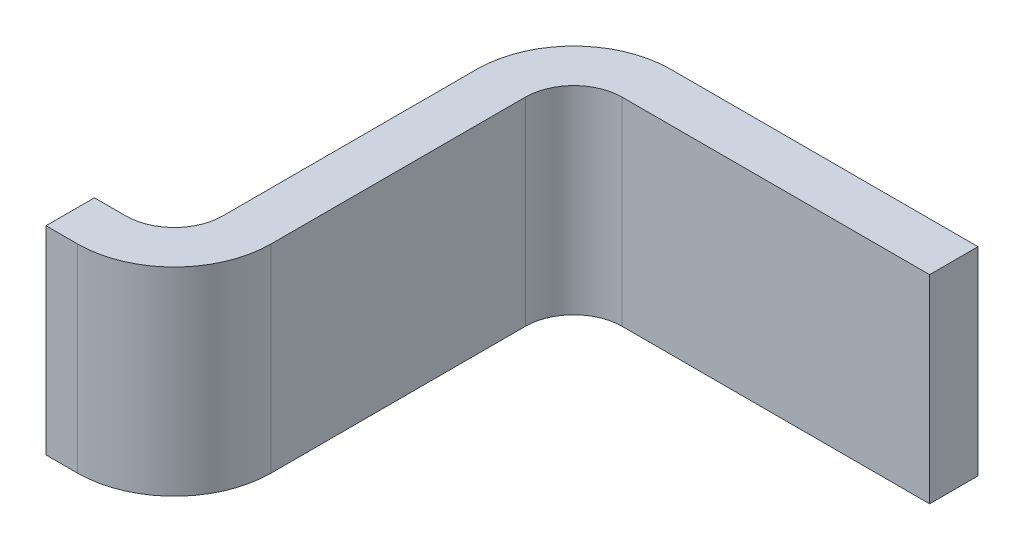
ISO-10303-21;
HEADER;
FILE_DESCRIPTION(('STEP AP214'),'2;1');
FILE_NAME('part.step','',(''),(''),'','','');
FILE_SCHEMA(('AUTOMOTIVE_DESIGN { 1 0 10303 214 1 1 1 1 }'));
ENDSEC;
DATA;
#1=APPLICATION_CONTEXT('core data for automotive mechanical design processes');
#2=APPLICATION_PROTOCOL_DEFINITION('international standard','automotive_design',2000,#1);
#3=PRODUCT_CONTEXT('',#1,'mechanical');
#4=PRODUCT('Part','Part','',(#3));
#5=PRODUCT_RELATED_PRODUCT_CATEGORY('part','',(#4));
#6=PRODUCT_DEFINITION_FORMATION('','',#4);
#7=PRODUCT_DEFINITION_CONTEXT('part definition',#1,'design');
#8=PRODUCT_DEFINITION('design','',#6,#7);
#9=PRODUCT_DEFINITION_SHAPE('','',#8);
#10=(LENGTH_UNIT() NAMED_UNIT(*) SI_UNIT(.MILLI.,.METRE.));
#11=(NAMED_UNIT(*) PLANE_ANGLE_UNIT() SI_UNIT($,.RADIAN.));
#12=(NAMED_UNIT(*) SI_UNIT($,.STERADIAN.) SOLID_ANGLE_UNIT());
#13=UNCERTAINTY_MEASURE_WITH_UNIT(LENGTH_MEASURE(1.E-05),#10,'distance_accuracy_value','');
#14=(GEOMETRIC_REPRESENTATION_CONTEXT(3) GLOBAL_UNCERTAINTY_ASSIGNED_CONTEXT((#13)) GLOBAL_UNIT_ASSIGNED_CONTEXT((#10,
#11,#12)) REPRESENTATION_CONTEXT('',''));
#15=CARTESIAN_POINT('',(0.,0.,0.));
#16=DIRECTION('',(0.,0.,1.));
#17=DIRECTION('',(1.,0.,0.));
#18=AXIS2_PLACEMENT_3D('',#15,#16,#17);
#19=CARTESIAN_POINT('',(0.,0.205,0.925));
#20=DIRECTION('',(0.,0.,-1.));
#21=DIRECTION('',(-1.,0.,0.));
#22=AXIS2_PLACEMENT_3D('',#19,#20,#21);
#23=PLANE('',#22);
#24=DIRECTION('',(1.,0.,0.));
#25=VECTOR('',#24,1.);
#26=CARTESIAN_POINT('',(0.,0.205,0.925));
#27=LINE('',#26,#25);
#28=CARTESIAN_POINT('',(0.065,0.205,0.925));
#29=VERTEX_POINT('',#28);
#30=CARTESIAN_POINT('',(0.,0.205,0.925));
#31=VERTEX_POINT('',#30);
#32=EDGE_CURVE('E104',#29,#31,#27,.F.);
#33=ORIENTED_EDGE('',*,*,#32,.T.);
#34=DIRECTION('',(0.,1.,0.));
#35=VECTOR('',#34,1.);
#36=CARTESIAN_POINT('',(0.,-0.205,0.925));
#37=LINE('',#36,#35);
#38=CARTESIAN_POINT('',(0.,-0.205,0.925));
#39=VERTEX_POINT('',#38);
#40=EDGE_CURVE('E113',#39,#31,#37,.T.);
#41=ORIENTED_EDGE('',*,*,#40,.F.);
#42=DIRECTION('',(1.,0.,0.));
#43=VECTOR('',#42,1.);
#44=CARTESIAN_POINT('',(0.,-0.205,0.925));
#45=LINE('',#44,#43);
#46=CARTESIAN_POINT('',(0.065,-0.205,0.925));
#47=VERTEX_POINT('',#46);
#48=EDGE_CURVE('E118',#39,#47,#45,.T.);
#49=ORIENTED_EDGE('',*,*,#48,.T.);
#50=DIRECTION('',(0.,1.,0.));
#51=VECTOR('',#50,1.);
#52=CARTESIAN_POINT('',(0.065,0.205,0.925));
#53=LINE('',#52,#51);
#54=EDGE_CURVE('E116',#29,#47,#53,.F.);
#55=ORIENTED_EDGE('',*,*,#54,.F.);
#56=EDGE_LOOP('',(#33,#41,#49,#55));
#57=FACE_BOUND('',#56,.T.);
#58=ADVANCED_FACE('F17',(#57),#23,.F.);
#59=CARTESIAN_POINT('',(0.,-0.205,0.825));
#60=DIRECTION('',(-1.,0.,0.));
#61=DIRECTION('',(0.,0.,1.));
#62=AXIS2_PLACEMENT_3D('',#59,#60,#61);
#63=PLANE('',#62);
#64=DIRECTION('',(0.,0.,1.));
#65=VECTOR('',#64,1.);
#66=CARTESIAN_POINT('',(0.,0.205,0.825));
#67=LINE('',#66,#65);
#68=CARTESIAN_POINT('',(0.,0.205,0.825));
#69=VERTEX_POINT('',#68);
#70=EDGE_CURVE('E111',#31,#69,#67,.F.);
#71=ORIENTED_EDGE('',*,*,#70,.T.);
#72=DIRECTION('',(0.,1.,0.));
#73=VECTOR('',#72,1.);
#74=CARTESIAN_POINT('',(0.,-0.205,0.825));
#75=LINE('',#74,#73);
#76=CARTESIAN_POINT('',(0.,-0.205,0.825));
#77=VERTEX_POINT('',#76);
#78=EDGE_CURVE('E127',#69,#77,#75,.F.);
#79=ORIENTED_EDGE('',*,*,#78,.T.);
#80=DIRECTION('',(0.,0.,1.));
#81=VECTOR('',#80,1.);
#82=CARTESIAN_POINT('',(0.,-0.205,0.925));
#83=LINE('',#82,#81);
#84=EDGE_CURVE('E140',#77,#39,#83,.T.);
#85=ORIENTED_EDGE('',*,*,#84,.T.);
#86=ORIENTED_EDGE('',*,*,#40,.T.);
#87=EDGE_LOOP('',(#71,#79,#85,#86));
#88=FACE_BOUND('',#87,.T.);
#89=ADVANCED_FACE('F277',(#88),#63,.T.);
#90=CARTESIAN_POINT('',(0.065,0.205,0.725));
#91=DIRECTION('',(0.,1.,0.));
#92=DIRECTION('',(0.,0.,1.));
#93=AXIS2_PLACEMENT_3D('',#90,#91,#92);
#94=CYLINDRICAL_SURFACE('',#93,0.2);
#95=CARTESIAN_POINT('',(0.065,0.205,0.725));
#96=DIRECTION('',(0.,1.,0.));
#97=DIRECTION('',(0.,0.,1.));
#98=AXIS2_PLACEMENT_3D('',#95,#96,#97);
#99=CIRCLE('',#98,0.2);
#100=CARTESIAN_POINT('',(0.265,0.205,0.725));
#101=VERTEX_POINT('',#100);
#102=EDGE_CURVE('E20',#29,#101,#99,.T.);
#103=ORIENTED_EDGE('',*,*,#102,.F.);
#104=ORIENTED_EDGE('',*,*,#54,.T.);
#105=CARTESIAN_POINT('',(0.065,-0.205,0.725));
#106=DIRECTION('',(0.,1.,0.));
#107=DIRECTION('',(0.,0.,1.));
#108=AXIS2_PLACEMENT_3D('',#105,#106,#107);
#109=CIRCLE('',#108,0.2);
#110=CARTESIAN_POINT('',(0.265,-0.205,0.725));
#111=VERTEX_POINT('',#110);
#112=EDGE_CURVE('E178',#111,#47,#109,.F.);
#113=ORIENTED_EDGE('',*,*,#112,.F.);
#114=DIRECTION('',(0.,1.,0.));
#115=VECTOR('',#114,1.);
#116=CARTESIAN_POINT('',(0.265,0.205,0.725));
#117=LINE('',#116,#115);
#118=EDGE_CURVE('E124',#111,#101,#117,.T.);
#119=ORIENTED_EDGE('',*,*,#118,.T.);
#120=EDGE_LOOP('',(#103,#104,#113,#119));
#121=FACE_BOUND('',#120,.T.);
#122=ADVANCED_FACE('F123',(#121),#94,.T.);
#123=CARTESIAN_POINT('',(0.,-0.205,0.825));
#124=DIRECTION('',(0.,0.,1.));
#125=DIRECTION('',(1.,0.,0.));
#126=AXIS2_PLACEMENT_3D('',#123,#124,#125);
#127=PLANE('',#126);
#128=DIRECTION('',(1.,0.,0.));
#129=VECTOR('',#128,1.);
#130=CARTESIAN_POINT('',(0.,-0.205,0.825));
#131=LINE('',#130,#129);
#132=CARTESIAN_POINT('',(0.065,-0.205,0.825));
#133=VERTEX_POINT('',#132);
#134=EDGE_CURVE('E131',#77,#133,#131,.T.);
#135=ORIENTED_EDGE('',*,*,#134,.F.);
#136=ORIENTED_EDGE('',*,*,#78,.F.);
#137=DIRECTION('',(1.,0.,0.));
#138=VECTOR('',#137,1.);
#139=CARTESIAN_POINT('',(0.,0.205,0.825));
#140=LINE('',#139,#138);
#141=CARTESIAN_POINT('',(0.065,0.205,0.825));
#142=VERTEX_POINT('',#141);
#143=EDGE_CURVE('E126',#142,#69,#140,.F.);
#144=ORIENTED_EDGE('',*,*,#143,.F.);
#145=DIRECTION('',(0.,1.,0.));
#146=VECTOR('',#145,1.);
#147=CARTESIAN_POINT('',(0.065,-0.205,0.825));
#148=LINE('',#147,#146);
#149=EDGE_CURVE('E175',#142,#133,#148,.F.);
#150=ORIENTED_EDGE('',*,*,#149,.T.);
#151=EDGE_LOOP('',(#135,#136,#144,#150));
#152=FACE_BOUND('',#151,.T.);
#153=ADVANCED_FACE('F271',(#152),#127,.F.);
#154=CARTESIAN_POINT('',(0.265,0.205,0.725));
#155=DIRECTION('',(-1.,0.,0.));
#156=DIRECTION('',(0.,0.,1.));
#157=AXIS2_PLACEMENT_3D('',#154,#155,#156);
#158=PLANE('',#157);
#159=DIRECTION('',(0.,0.,-1.));
#160=VECTOR('',#159,1.);
#161=CARTESIAN_POINT('',(0.265,0.205,0.725));
#162=LINE('',#161,#160);
#163=CARTESIAN_POINT('',(0.265,0.205,0.2));
#164=VERTEX_POINT('',#163);
#165=EDGE_CURVE('E177',#164,#101,#162,.F.);
#166=ORIENTED_EDGE('',*,*,#165,.T.);
#167=ORIENTED_EDGE('',*,*,#118,.F.);
#168=DIRECTION('',(0.,0.,1.));
#169=VECTOR('',#168,1.);
#170=CARTESIAN_POINT('',(0.265,-0.205,0.725));
#171=LINE('',#170,#169);
#172=CARTESIAN_POINT('',(0.265,-0.205,0.2));
#173=VERTEX_POINT('',#172);
#174=EDGE_CURVE('E174',#111,#173,#171,.F.);
#175=ORIENTED_EDGE('',*,*,#174,.T.);
#176=DIRECTION('',(0.,-1.,0.));
#177=VECTOR('',#176,1.);
#178=CARTESIAN_POINT('',(0.265,0.205,0.2));
#179=LINE('',#178,#177);
#180=EDGE_CURVE('E171',#173,#164,#179,.F.);
#181=ORIENTED_EDGE('',*,*,#180,.T.);
#182=EDGE_LOOP('',(#166,#167,#175,#181));
#183=FACE_BOUND('',#182,.T.);
#184=ADVANCED_FACE('F267',(#183),#158,.F.);
#185=CARTESIAN_POINT('',(0.065,-0.205,0.725));
#186=DIRECTION('',(0.,1.,0.));
#187=DIRECTION('',(0.,0.,1.));
#188=AXIS2_PLACEMENT_3D('',#185,#186,#187);
#189=CYLINDRICAL_SURFACE('',#188,0.1);
#190=CARTESIAN_POINT('',(0.065,-0.205,0.725));
#191=DIRECTION('',(0.,1.,0.));
#192=DIRECTION('',(0.,0.,1.));
#193=AXIS2_PLACEMENT_3D('',#190,#191,#192);
#194=CIRCLE('',#193,0.1);
#195=CARTESIAN_POINT('',(0.165,-0.205,0.725));
#196=VERTEX_POINT('',#195);
#197=EDGE_CURVE('E172',#133,#196,#194,.T.);
#198=ORIENTED_EDGE('',*,*,#197,.F.);
#199=ORIENTED_EDGE('',*,*,#149,.F.);
#200=CARTESIAN_POINT('',(0.065,0.205,0.725));
#201=DIRECTION('',(0.,1.,0.));
#202=DIRECTION('',(0.,0.,1.));
#203=AXIS2_PLACEMENT_3D('',#200,#201,#202);
#204=CIRCLE('',#203,0.1);
#205=CARTESIAN_POINT('',(0.165,0.205,0.725));
#206=VERTEX_POINT('',#205);
#207=EDGE_CURVE('E176',#206,#142,#204,.F.);
#208=ORIENTED_EDGE('',*,*,#207,.F.);
#209=DIRECTION('',(0.,1.,0.));
#210=VECTOR('',#209,1.);
#211=CARTESIAN_POINT('',(0.165,-0.205,0.725));
#212=LINE('',#211,#210);
#213=EDGE_CURVE('E188',#206,#196,#212,.F.);
#214=ORIENTED_EDGE('',*,*,#213,.T.);
#215=EDGE_LOOP('',(#198,#199,#208,#214));
#216=FACE_BOUND('',#215,.T.);
#217=ADVANCED_FACE('F263',(#216),#189,.F.);
#218=CARTESIAN_POINT('',(0.365,0.205,0.2));
#219=DIRECTION('',(0.,-1.,0.));
#220=DIRECTION('',(0.,0.,-1.));
#221=AXIS2_PLACEMENT_3D('',#218,#219,#220);
#222=CYLINDRICAL_SURFACE('',#221,0.1);
#223=CARTESIAN_POINT('',(0.365,0.205,0.2));
#224=DIRECTION('',(0.,-1.,0.));
#225=DIRECTION('',(0.,0.,-1.));
#226=AXIS2_PLACEMENT_3D('',#223,#224,#225);
#227=CIRCLE('',#226,0.1);
#228=CARTESIAN_POINT('',(0.365,0.205,0.1));
#229=VERTEX_POINT('',#228);
#230=EDGE_CURVE('E168',#164,#229,#227,.T.);
#231=ORIENTED_EDGE('',*,*,#230,.F.);
#232=ORIENTED_EDGE('',*,*,#180,.F.);
#233=CARTESIAN_POINT('',(0.365,-0.205,0.2));
#234=DIRECTION('',(0.,-1.,0.));
#235=DIRECTION('',(0.,0.,-1.));
#236=AXIS2_PLACEMENT_3D('',#233,#234,#235);
#237=CIRCLE('',#236,0.1);
#238=CARTESIAN_POINT('',(0.365,-0.205,0.1));
#239=VERTEX_POINT('',#238);
#240=EDGE_CURVE('E163',#239,#173,#237,.F.);
#241=ORIENTED_EDGE('',*,*,#240,.F.);
#242=DIRECTION('',(0.,1.,0.));
#243=VECTOR('',#242,1.);
#244=CARTESIAN_POINT('',(0.365,0.205,0.1));
#245=LINE('',#244,#243);
#246=EDGE_CURVE('E166',#239,#229,#245,.T.);
#247=ORIENTED_EDGE('',*,*,#246,.T.);
#248=EDGE_LOOP('',(#231,#232,#241,#247));
#249=FACE_BOUND('',#248,.T.);
#250=ADVANCED_FACE('F259',(#249),#222,.F.);
#251=CARTESIAN_POINT('',(0.165,-0.205,0.725));
#252=DIRECTION('',(1.,0.,0.));
#253=DIRECTION('',(0.,0.,-1.));
#254=AXIS2_PLACEMENT_3D('',#251,#252,#253);
#255=PLANE('',#254);
#256=DIRECTION('',(0.,0.,-1.));
#257=VECTOR('',#256,1.);
#258=CARTESIAN_POINT('',(0.165,-0.205,0.725));
#259=LINE('',#258,#257);
#260=CARTESIAN_POINT('',(0.165,-0.205,0.2));
#261=VERTEX_POINT('',#260);
#262=EDGE_CURVE('E167',#196,#261,#259,.T.);
#263=ORIENTED_EDGE('',*,*,#262,.F.);
#264=ORIENTED_EDGE('',*,*,#213,.F.);
#265=DIRECTION('',(0.,0.,-1.));
#266=VECTOR('',#265,1.);
#267=CARTESIAN_POINT('',(0.165,0.205,0.725));
#268=LINE('',#267,#266);
#269=CARTESIAN_POINT('',(0.165,0.205,0.2));
#270=VERTEX_POINT('',#269);
#271=EDGE_CURVE('E170',#270,#206,#268,.F.);
#272=ORIENTED_EDGE('',*,*,#271,.F.);
#273=DIRECTION('',(0.,-1.,0.));
#274=VECTOR('',#273,1.);
#275=CARTESIAN_POINT('',(0.165,-0.205,0.2));
#276=LINE('',#275,#274);
#277=EDGE_CURVE('E159',#261,#270,#276,.F.);
#278=ORIENTED_EDGE('',*,*,#277,.F.);
#279=EDGE_LOOP('',(#263,#264,#272,#278));
#280=FACE_BOUND('',#279,.T.);
#281=ADVANCED_FACE('F255',(#280),#255,.F.);
#282=CARTESIAN_POINT('',(0.365,0.205,0.1));
#283=DIRECTION('',(0.,0.,-1.));
#284=DIRECTION('',(-1.,0.,0.));
#285=AXIS2_PLACEMENT_3D('',#282,#283,#284);
#286=PLANE('',#285);
#287=DIRECTION('',(1.,0.,0.));
#288=VECTOR('',#287,1.);
#289=CARTESIAN_POINT('',(0.365,0.205,0.1));
#290=LINE('',#289,#288);
#291=CARTESIAN_POINT('',(1.,0.205,0.1));
#292=VERTEX_POINT('',#291);
#293=EDGE_CURVE('E162',#292,#229,#290,.F.);
#294=ORIENTED_EDGE('',*,*,#293,.T.);
#295=ORIENTED_EDGE('',*,*,#246,.F.);
#296=DIRECTION('',(1.,0.,0.));
#297=VECTOR('',#296,1.);
#298=CARTESIAN_POINT('',(0.365,-0.205,0.1));
#299=LINE('',#298,#297);
#300=CARTESIAN_POINT('',(1.,-0.205,0.1));
#301=VERTEX_POINT('',#300);
#302=EDGE_CURVE('E216',#239,#301,#299,.T.);
#303=ORIENTED_EDGE('',*,*,#302,.T.);
#304=DIRECTION('',(0.,1.,0.));
#305=VECTOR('',#304,1.);
#306=CARTESIAN_POINT('',(1.,-0.205,0.1));
#307=LINE('',#306,#305);
#308=EDGE_CURVE('E197',#301,#292,#307,.T.);
#309=ORIENTED_EDGE('',*,*,#308,.T.);
#310=EDGE_LOOP('',(#294,#295,#303,#309));
#311=FACE_BOUND('',#310,.T.);
#312=ADVANCED_FACE('F252',(#311),#286,.F.);
#313=CARTESIAN_POINT('',(0.365,0.205,0.));
#314=DIRECTION('',(0.,-1.,0.));
#315=DIRECTION('',(0.,0.,-1.));
#316=AXIS2_PLACEMENT_3D('',#313,#314,#315);
#317=PLANE('',#316);
#318=DIRECTION('',(1.,0.,0.));
#319=VECTOR('',#318,1.);
#320=CARTESIAN_POINT('',(0.365,0.205,0.));
#321=LINE('',#320,#319);
#322=CARTESIAN_POINT('',(1.,0.205,0.));
#323=VERTEX_POINT('',#322);
#324=CARTESIAN_POINT('',(0.365,0.205,0.));
#325=VERTEX_POINT('',#324);
#326=EDGE_CURVE('E205',#323,#325,#321,.F.);
#327=ORIENTED_EDGE('',*,*,#326,.T.);
#328=CARTESIAN_POINT('',(0.365,0.205,0.2));
#329=DIRECTION('',(0.,-1.,0.));
#330=DIRECTION('',(0.,0.,-1.));
#331=AXIS2_PLACEMENT_3D('',#328,#329,#330);
#332=CIRCLE('',#331,0.2);
#333=EDGE_CURVE('E160',#270,#325,#332,.T.);
#334=ORIENTED_EDGE('',*,*,#333,.F.);
#335=ORIENTED_EDGE('',*,*,#271,.T.);
#336=ORIENTED_EDGE('',*,*,#207,.T.);
#337=ORIENTED_EDGE('',*,*,#143,.T.);
#338=ORIENTED_EDGE('',*,*,#70,.F.);
#339=ORIENTED_EDGE('',*,*,#32,.F.);
#340=ORIENTED_EDGE('',*,*,#102,.T.);
#341=ORIENTED_EDGE('',*,*,#165,.F.);
#342=ORIENTED_EDGE('',*,*,#230,.T.);
#343=ORIENTED_EDGE('',*,*,#293,.F.);
#344=DIRECTION('',(0.,0.,1.));
#345=VECTOR('',#344,1.);
#346=CARTESIAN_POINT('',(1.,0.205,0.));
#347=LINE('',#346,#345);
#348=EDGE_CURVE('E200',#292,#323,#347,.F.);
#349=ORIENTED_EDGE('',*,*,#348,.T.);
#350=EDGE_LOOP('',(#327,#334,#335,#336,#337,#338,#339,#340,#341,#342,#343,#349));
#351=FACE_BOUND('',#350,.T.);
#352=ADVANCED_FACE('F107',(#351),#317,.F.);
#353=CARTESIAN_POINT('',(0.365,-0.205,0.2));
#354=DIRECTION('',(0.,-1.,0.));
#355=DIRECTION('',(0.,0.,-1.));
#356=AXIS2_PLACEMENT_3D('',#353,#354,#355);
#357=CYLINDRICAL_SURFACE('',#356,0.2);
#358=CARTESIAN_POINT('',(0.365,-0.205,0.2));
#359=DIRECTION('',(0.,-1.,0.));
#360=DIRECTION('',(0.,0.,-1.));
#361=AXIS2_PLACEMENT_3D('',#358,#359,#360);
#362=CIRCLE('',#361,0.2);
#363=CARTESIAN_POINT('',(0.365,-0.205,0.));
#364=VERTEX_POINT('',#363);
#365=EDGE_CURVE('E157',#364,#261,#362,.F.);
#366=ORIENTED_EDGE('',*,*,#365,.T.);
#367=ORIENTED_EDGE('',*,*,#277,.T.);
#368=ORIENTED_EDGE('',*,*,#333,.T.);
#369=DIRECTION('',(0.,1.,0.));
#370=VECTOR('',#369,1.);
#371=CARTESIAN_POINT('',(0.365,-0.205,0.));
#372=LINE('',#371,#370);
#373=EDGE_CURVE('E211',#325,#364,#372,.F.);
#374=ORIENTED_EDGE('',*,*,#373,.T.);
#375=EDGE_LOOP('',(#366,#367,#368,#374));
#376=FACE_BOUND('',#375,.T.);
#377=ADVANCED_FACE('F233',(#376),#357,.T.);
#378=CARTESIAN_POINT('',(0.365,-0.205,0.1));
#379=DIRECTION('',(0.,1.,0.));
#380=DIRECTION('',(0.,0.,1.));
#381=AXIS2_PLACEMENT_3D('',#378,#379,#380);
#382=PLANE('',#381);
#383=ORIENTED_EDGE('',*,*,#302,.F.);
#384=ORIENTED_EDGE('',*,*,#240,.T.);
#385=ORIENTED_EDGE('',*,*,#174,.F.);
#386=ORIENTED_EDGE('',*,*,#112,.T.);
#387=ORIENTED_EDGE('',*,*,#48,.F.);
#388=ORIENTED_EDGE('',*,*,#84,.F.);
#389=ORIENTED_EDGE('',*,*,#134,.T.);
#390=ORIENTED_EDGE('',*,*,#197,.T.);
#391=ORIENTED_EDGE('',*,*,#262,.T.);
#392=ORIENTED_EDGE('',*,*,#365,.F.);
#393=DIRECTION('',(1.,0.,0.));
#394=VECTOR('',#393,1.);
#395=CARTESIAN_POINT('',(0.365,-0.205,0.));
#396=LINE('',#395,#394);
#397=CARTESIAN_POINT('',(1.,-0.205,0.));
#398=VERTEX_POINT('',#397);
#399=EDGE_CURVE('E26',#364,#398,#396,.T.);
#400=ORIENTED_EDGE('',*,*,#399,.T.);
#401=DIRECTION('',(0.,0.,1.));
#402=VECTOR('',#401,1.);
#403=CARTESIAN_POINT('',(1.,-0.205,0.));
#404=LINE('',#403,#402);
#405=EDGE_CURVE('E34',#398,#301,#404,.T.);
#406=ORIENTED_EDGE('',*,*,#405,.T.);
#407=EDGE_LOOP('',(#383,#384,#385,#386,#387,#388,#389,#390,#391,#392,#400,#406));
#408=FACE_BOUND('',#407,.T.);
#409=ADVANCED_FACE('F227',(#408),#382,.F.);
#410=CARTESIAN_POINT('',(1.,-0.205,0.));
#411=DIRECTION('',(-1.,0.,0.));
#412=DIRECTION('',(0.,0.,1.));
#413=AXIS2_PLACEMENT_3D('',#410,#411,#412);
#414=PLANE('',#413);
#415=ORIENTED_EDGE('',*,*,#348,.F.);
#416=ORIENTED_EDGE('',*,*,#308,.F.);
#417=ORIENTED_EDGE('',*,*,#405,.F.);
#418=DIRECTION('',(0.,1.,0.));
#419=VECTOR('',#418,1.);
#420=CARTESIAN_POINT('',(1.,-0.205,0.));
#421=LINE('',#420,#419);
#422=EDGE_CURVE('E11',#398,#323,#421,.T.);
#423=ORIENTED_EDGE('',*,*,#422,.T.);
#424=EDGE_LOOP('',(#415,#416,#417,#423));
#425=FACE_BOUND('',#424,.T.);
#426=ADVANCED_FACE('F237',(#425),#414,.F.);
#427=CARTESIAN_POINT('',(0.365,-0.205,0.));
#428=DIRECTION('',(0.,0.,1.));
#429=DIRECTION('',(1.,0.,0.));
#430=AXIS2_PLACEMENT_3D('',#427,#428,#429);
#431=PLANE('',#430);
#432=ORIENTED_EDGE('',*,*,#399,.F.);
#433=ORIENTED_EDGE('',*,*,#373,.F.);
#434=ORIENTED_EDGE('',*,*,#326,.F.);
#435=ORIENTED_EDGE('',*,*,#422,.F.);
#436=EDGE_LOOP('',(#432,#433,#434,#435));
#437=FACE_BOUND('',#436,.T.);
#438=ADVANCED_FACE('F231',(#437),#431,.F.);
#439=CLOSED_SHELL('',(#58,#89,#122,#153,#184,#217,#250,#281,#312,#352,#377,#409,#426,#438));
#440=MANIFOLD_SOLID_BREP('B1',#439);
#441=ADVANCED_BREP_SHAPE_REPRESENTATION('',(#18,#440),#14);
#442=SHAPE_DEFINITION_REPRESENTATION(#9,#441);
ENDSEC;
END-ISO-10303-21;
